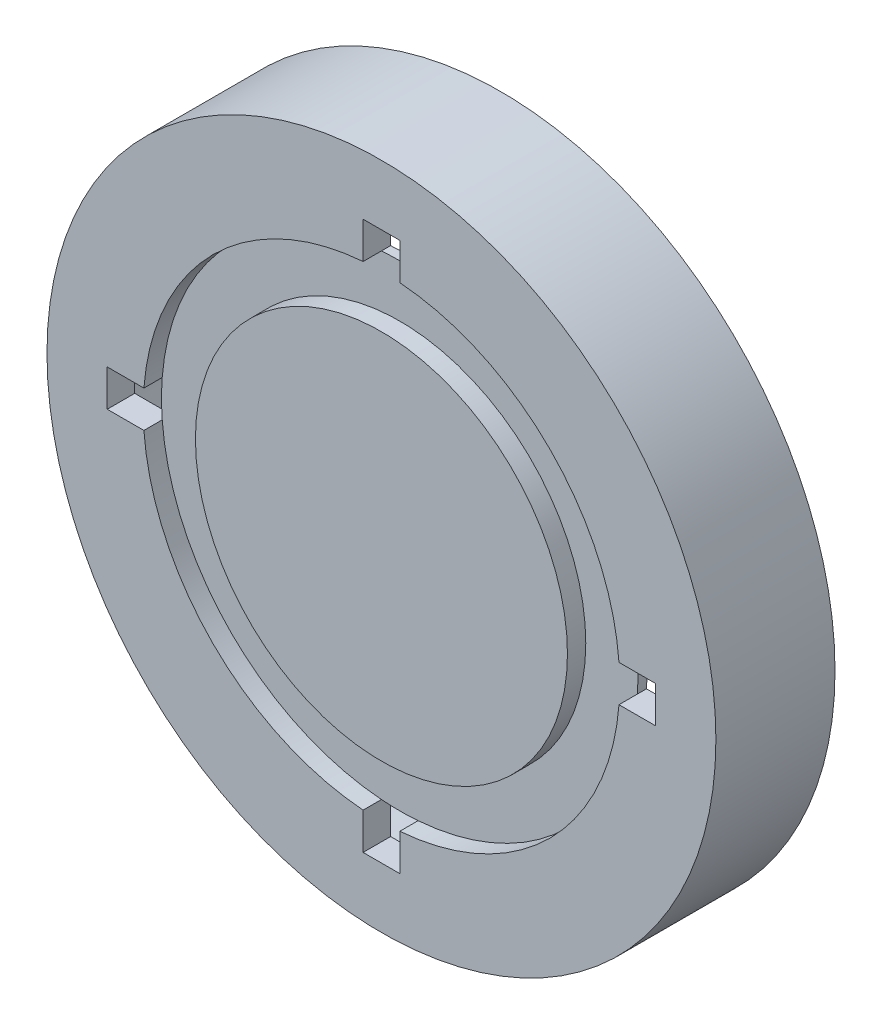
ISO-10303-21;
HEADER;
FILE_DESCRIPTION(('STEP AP214'),'2;1');
FILE_NAME('part.step','',(''),(''),'','','');
FILE_SCHEMA(('AUTOMOTIVE_DESIGN { 1 0 10303 214 1 1 1 1 }'));
ENDSEC;
DATA;
#1=APPLICATION_CONTEXT('core data for automotive mechanical design processes');
#2=APPLICATION_PROTOCOL_DEFINITION('international standard','automotive_design',2000,#1);
#3=PRODUCT_CONTEXT('',#1,'mechanical');
#4=PRODUCT('Part','Part','',(#3));
#5=PRODUCT_RELATED_PRODUCT_CATEGORY('part','',(#4));
#6=PRODUCT_DEFINITION_FORMATION('','',#4);
#7=PRODUCT_DEFINITION_CONTEXT('part definition',#1,'design');
#8=PRODUCT_DEFINITION('design','',#6,#7);
#9=PRODUCT_DEFINITION_SHAPE('','',#8);
#10=(LENGTH_UNIT() NAMED_UNIT(*) SI_UNIT(.MILLI.,.METRE.));
#11=(NAMED_UNIT(*) PLANE_ANGLE_UNIT() SI_UNIT($,.RADIAN.));
#12=(NAMED_UNIT(*) SI_UNIT($,.STERADIAN.) SOLID_ANGLE_UNIT());
#13=UNCERTAINTY_MEASURE_WITH_UNIT(LENGTH_MEASURE(1.E-05),#10,'distance_accuracy_value','');
#14=(GEOMETRIC_REPRESENTATION_CONTEXT(3) GLOBAL_UNCERTAINTY_ASSIGNED_CONTEXT((#13)) GLOBAL_UNIT_ASSIGNED_CONTEXT((#10,
#11,#12)) REPRESENTATION_CONTEXT('',''));
#15=CARTESIAN_POINT('',(0.,0.,0.));
#16=DIRECTION('',(0.,0.,1.));
#17=DIRECTION('',(1.,0.,0.));
#18=AXIS2_PLACEMENT_3D('',#15,#16,#17);
#19=CARTESIAN_POINT('',(0.,0.,0.));
#20=DIRECTION('',(0.,0.,1.));
#21=DIRECTION('',(1.,0.,0.));
#22=AXIS2_PLACEMENT_3D('',#19,#20,#21);
#23=PLANE('',#22);
#24=DIRECTION('',(0.,1.,0.));
#25=VECTOR('',#24,1.);
#26=CARTESIAN_POINT('',(-2.54000000000013,0.,0.));
#27=LINE('',#26,#25);
#28=CARTESIAN_POINT('',(-2.53999999999999,-38.0021627479119,0.));
#29=VERTEX_POINT('',#28);
#30=CARTESIAN_POINT('',(-2.53999999999999,-32.9221627479119,0.));
#31=VERTEX_POINT('',#30);
#32=EDGE_CURVE('E213',#29,#31,#27,.T.);
#33=ORIENTED_EDGE('',*,*,#32,.F.);
#34=DIRECTION('',(1.,0.,0.));
#35=VECTOR('',#34,1.);
#36=CARTESIAN_POINT('',(0.,-38.0021627479119,0.));
#37=LINE('',#36,#35);
#38=CARTESIAN_POINT('',(2.54,-38.0021627479119,0.));
#39=VERTEX_POINT('',#38);
#40=EDGE_CURVE('E215',#29,#39,#37,.T.);
#41=ORIENTED_EDGE('',*,*,#40,.T.);
#42=DIRECTION('',(0.,1.,0.));
#43=VECTOR('',#42,1.);
#44=CARTESIAN_POINT('',(2.54000000000013,0.,0.));
#45=LINE('',#44,#43);
#46=CARTESIAN_POINT('',(2.53999999999999,-32.9221627479119,0.));
#47=VERTEX_POINT('',#46);
#48=EDGE_CURVE('E56',#39,#47,#45,.T.);
#49=ORIENTED_EDGE('',*,*,#48,.T.);
#50=CARTESIAN_POINT('',(0.,0.,0.));
#51=DIRECTION('',(0.,0.,1.));
#52=DIRECTION('',(1.,0.,0.));
#53=AXIS2_PLACEMENT_3D('',#50,#51,#52);
#54=CIRCLE('',#53,33.02);
#55=EDGE_CURVE('E220',#47,#31,#54,.F.);
#56=ORIENTED_EDGE('',*,*,#55,.T.);
#57=EDGE_LOOP('',(#33,#41,#49,#56));
#58=FACE_BOUND('',#57,.T.);
#59=CARTESIAN_POINT('',(0.,0.,0.));
#60=DIRECTION('',(0.,0.,1.));
#61=DIRECTION('',(1.,0.,0.));
#62=AXIS2_PLACEMENT_3D('',#59,#60,#61);
#63=CIRCLE('',#62,33.02);
#64=CARTESIAN_POINT('',(32.9221627479119,2.53999999999978,0.));
#65=VERTEX_POINT('',#64);
#66=CARTESIAN_POINT('',(32.9221627479119,-2.54000000000001,0.));
#67=VERTEX_POINT('',#66);
#68=EDGE_CURVE('E251',#65,#67,#63,.F.);
#69=ORIENTED_EDGE('',*,*,#68,.T.);
#70=DIRECTION('',(1.,0.,0.));
#71=VECTOR('',#70,1.);
#72=CARTESIAN_POINT('',(0.,-2.54,0.));
#73=LINE('',#72,#71);
#74=CARTESIAN_POINT('',(38.0021627479119,-2.54000000000001,0.));
#75=VERTEX_POINT('',#74);
#76=EDGE_CURVE('E241',#67,#75,#73,.T.);
#77=ORIENTED_EDGE('',*,*,#76,.T.);
#78=DIRECTION('',(0.,1.,0.));
#79=VECTOR('',#78,1.);
#80=CARTESIAN_POINT('',(38.0021627479119,0.,0.));
#81=LINE('',#80,#79);
#82=CARTESIAN_POINT('',(38.0021627479119,2.54000000000001,0.));
#83=VERTEX_POINT('',#82);
#84=EDGE_CURVE('E244',#75,#83,#81,.T.);
#85=ORIENTED_EDGE('',*,*,#84,.T.);
#86=DIRECTION('',(1.,0.,0.));
#87=VECTOR('',#86,1.);
#88=CARTESIAN_POINT('',(0.,2.54,0.));
#89=LINE('',#88,#87);
#90=EDGE_CURVE('E248',#65,#83,#89,.T.);
#91=ORIENTED_EDGE('',*,*,#90,.F.);
#92=EDGE_LOOP('',(#69,#77,#85,#91));
#93=FACE_BOUND('',#92,.T.);
#94=DIRECTION('',(0.,-1.,0.));
#95=VECTOR('',#94,1.);
#96=CARTESIAN_POINT('',(2.54,0.,0.));
#97=LINE('',#96,#95);
#98=CARTESIAN_POINT('',(2.54,38.0021627479119,0.));
#99=VERTEX_POINT('',#98);
#100=CARTESIAN_POINT('',(2.53999999999999,32.9221627479119,0.));
#101=VERTEX_POINT('',#100);
#102=EDGE_CURVE('E272',#99,#101,#97,.T.);
#103=ORIENTED_EDGE('',*,*,#102,.F.);
#104=DIRECTION('',(1.,0.,0.));
#105=VECTOR('',#104,1.);
#106=CARTESIAN_POINT('',(0.,38.0021627479119,0.));
#107=LINE('',#106,#105);
#108=CARTESIAN_POINT('',(-2.54000000000001,38.0021627479119,0.));
#109=VERTEX_POINT('',#108);
#110=EDGE_CURVE('E274',#109,#99,#107,.T.);
#111=ORIENTED_EDGE('',*,*,#110,.F.);
#112=DIRECTION('',(0.,-1.,0.));
#113=VECTOR('',#112,1.);
#114=CARTESIAN_POINT('',(-2.54000000000001,0.,0.));
#115=LINE('',#114,#113);
#116=CARTESIAN_POINT('',(-2.54000000000001,32.9221627479119,0.));
#117=VERTEX_POINT('',#116);
#118=EDGE_CURVE('E277',#109,#117,#115,.T.);
#119=ORIENTED_EDGE('',*,*,#118,.T.);
#120=CARTESIAN_POINT('',(0.,0.,0.));
#121=DIRECTION('',(0.,0.,1.));
#122=DIRECTION('',(1.,0.,0.));
#123=AXIS2_PLACEMENT_3D('',#120,#121,#122);
#124=CIRCLE('',#123,33.02);
#125=EDGE_CURVE('E280',#117,#101,#124,.F.);
#126=ORIENTED_EDGE('',*,*,#125,.T.);
#127=EDGE_LOOP('',(#103,#111,#119,#126));
#128=FACE_BOUND('',#127,.T.);
#129=DIRECTION('',(-1.,0.,0.));
#130=VECTOR('',#129,1.);
#131=CARTESIAN_POINT('',(0.,-2.54,0.));
#132=LINE('',#131,#130);
#133=CARTESIAN_POINT('',(-32.9221627479119,-2.53999999999999,0.));
#134=VERTEX_POINT('',#133);
#135=CARTESIAN_POINT('',(-38.0021627479119,-2.54,0.));
#136=VERTEX_POINT('',#135);
#137=EDGE_CURVE('E189',#134,#136,#132,.T.);
#138=ORIENTED_EDGE('',*,*,#137,.F.);
#139=CARTESIAN_POINT('',(0.,0.,0.));
#140=DIRECTION('',(0.,0.,1.));
#141=DIRECTION('',(1.,0.,0.));
#142=AXIS2_PLACEMENT_3D('',#139,#140,#141);
#143=CIRCLE('',#142,33.02);
#144=CARTESIAN_POINT('',(-32.9221627479119,2.53999999999999,0.));
#145=VERTEX_POINT('',#144);
#146=EDGE_CURVE('E174',#134,#145,#143,.F.);
#147=ORIENTED_EDGE('',*,*,#146,.T.);
#148=DIRECTION('',(-1.,0.,0.));
#149=VECTOR('',#148,1.);
#150=CARTESIAN_POINT('',(0.,2.54,0.));
#151=LINE('',#150,#149);
#152=CARTESIAN_POINT('',(-38.0021627479119,2.54,0.));
#153=VERTEX_POINT('',#152);
#154=EDGE_CURVE('E182',#145,#153,#151,.T.);
#155=ORIENTED_EDGE('',*,*,#154,.T.);
#156=DIRECTION('',(0.,1.,0.));
#157=VECTOR('',#156,1.);
#158=CARTESIAN_POINT('',(-38.0021627479119,0.,0.));
#159=LINE('',#158,#157);
#160=EDGE_CURVE('E186',#136,#153,#159,.T.);
#161=ORIENTED_EDGE('',*,*,#160,.F.);
#162=EDGE_LOOP('',(#138,#147,#155,#161));
#163=FACE_BOUND('',#162,.T.);
#164=CARTESIAN_POINT('',(0.,0.,0.));
#165=DIRECTION('',(0.,0.,-1.));
#166=DIRECTION('',(-1.,0.,0.));
#167=AXIS2_PLACEMENT_3D('',#164,#165,#166);
#168=CIRCLE('',#167,44.45);
#169=CARTESIAN_POINT('',(44.45,0.,0.));
#170=VERTEX_POINT('',#169);
#171=EDGE_CURVE('E598',#170,#170,#168,.T.);
#172=ORIENTED_EDGE('',*,*,#171,.T.);
#173=EDGE_LOOP('',(#172));
#174=FACE_BOUND('',#173,.T.);
#175=ADVANCED_FACE('F33',(#58,#93,#128,#163,#174),#23,.F.);
#176=CARTESIAN_POINT('',(0.,0.,3.81));
#177=DIRECTION('',(0.,0.,1.));
#178=DIRECTION('',(1.,0.,0.));
#179=AXIS2_PLACEMENT_3D('',#176,#177,#178);
#180=PLANE('',#179);
#181=CARTESIAN_POINT('',(0.,0.,3.81));
#182=DIRECTION('',(0.,0.,1.));
#183=DIRECTION('',(1.,0.,0.));
#184=AXIS2_PLACEMENT_3D('',#181,#182,#183);
#185=CIRCLE('',#184,46.355);
#186=CARTESIAN_POINT('',(-46.355,0.,3.81));
#187=VERTEX_POINT('',#186);
#188=EDGE_CURVE('E11',#187,#187,#185,.T.);
#189=ORIENTED_EDGE('',*,*,#188,.T.);
#190=EDGE_LOOP('',(#189));
#191=FACE_BOUND('',#190,.T.);
#192=CARTESIAN_POINT('',(0.,0.,3.81));
#193=DIRECTION('',(0.,0.,1.));
#194=DIRECTION('',(1.,0.,0.));
#195=AXIS2_PLACEMENT_3D('',#192,#193,#194);
#196=CIRCLE('',#195,33.02);
#197=CARTESIAN_POINT('',(-32.9221627479119,-2.53999999999999,3.81));
#198=VERTEX_POINT('',#197);
#199=CARTESIAN_POINT('',(-2.53999999999999,-32.9221627479119,3.81));
#200=VERTEX_POINT('',#199);
#201=EDGE_CURVE('E312',#198,#200,#196,.T.);
#202=ORIENTED_EDGE('',*,*,#201,.F.);
#203=DIRECTION('',(-1.,0.,0.));
#204=VECTOR('',#203,1.);
#205=CARTESIAN_POINT('',(0.,-2.54,3.81));
#206=LINE('',#205,#204);
#207=CARTESIAN_POINT('',(-38.0021627479119,-2.54,3.81));
#208=VERTEX_POINT('',#207);
#209=EDGE_CURVE('E190',#198,#208,#206,.T.);
#210=ORIENTED_EDGE('',*,*,#209,.T.);
#211=DIRECTION('',(0.,1.,0.));
#212=VECTOR('',#211,1.);
#213=CARTESIAN_POINT('',(-38.0021627479119,0.,3.81));
#214=LINE('',#213,#212);
#215=CARTESIAN_POINT('',(-38.0021627479119,2.54,3.81));
#216=VERTEX_POINT('',#215);
#217=EDGE_CURVE('E193',#208,#216,#214,.T.);
#218=ORIENTED_EDGE('',*,*,#217,.T.);
#219=DIRECTION('',(-1.,0.,0.));
#220=VECTOR('',#219,1.);
#221=CARTESIAN_POINT('',(0.,2.54,3.81));
#222=LINE('',#221,#220);
#223=CARTESIAN_POINT('',(-32.9221627479119,2.53999999999999,3.81));
#224=VERTEX_POINT('',#223);
#225=EDGE_CURVE('E201',#224,#216,#222,.T.);
#226=ORIENTED_EDGE('',*,*,#225,.F.);
#227=CARTESIAN_POINT('',(-2.54000000000001,32.9221627479119,3.81));
#228=VERTEX_POINT('',#227);
#229=EDGE_CURVE('E310',#228,#224,#196,.T.);
#230=ORIENTED_EDGE('',*,*,#229,.F.);
#231=DIRECTION('',(0.,-1.,0.));
#232=VECTOR('',#231,1.);
#233=CARTESIAN_POINT('',(-2.54000000000001,0.,3.81));
#234=LINE('',#233,#232);
#235=CARTESIAN_POINT('',(-2.54000000000001,38.0021627479119,3.81));
#236=VERTEX_POINT('',#235);
#237=EDGE_CURVE('E275',#236,#228,#234,.T.);
#238=ORIENTED_EDGE('',*,*,#237,.F.);
#239=DIRECTION('',(1.,0.,0.));
#240=VECTOR('',#239,1.);
#241=CARTESIAN_POINT('',(0.,38.0021627479119,3.81));
#242=LINE('',#241,#240);
#243=CARTESIAN_POINT('',(2.54,38.0021627479119,3.81));
#244=VERTEX_POINT('',#243);
#245=EDGE_CURVE('E286',#236,#244,#242,.T.);
#246=ORIENTED_EDGE('',*,*,#245,.T.);
#247=DIRECTION('',(0.,-1.,0.));
#248=VECTOR('',#247,1.);
#249=CARTESIAN_POINT('',(2.54,0.,3.81));
#250=LINE('',#249,#248);
#251=CARTESIAN_POINT('',(2.53999999999999,32.9221627479119,3.81));
#252=VERTEX_POINT('',#251);
#253=EDGE_CURVE('E208',#244,#252,#250,.T.);
#254=ORIENTED_EDGE('',*,*,#253,.T.);
#255=CARTESIAN_POINT('',(32.9221627479119,2.53999999999978,3.81));
#256=VERTEX_POINT('',#255);
#257=EDGE_CURVE('E304',#256,#252,#196,.T.);
#258=ORIENTED_EDGE('',*,*,#257,.F.);
#259=DIRECTION('',(1.,0.,0.));
#260=VECTOR('',#259,1.);
#261=CARTESIAN_POINT('',(0.,2.54,3.81));
#262=LINE('',#261,#260);
#263=CARTESIAN_POINT('',(38.0021627479119,2.54000000000001,3.81));
#264=VERTEX_POINT('',#263);
#265=EDGE_CURVE('E245',#256,#264,#262,.T.);
#266=ORIENTED_EDGE('',*,*,#265,.T.);
#267=DIRECTION('',(0.,1.,0.));
#268=VECTOR('',#267,1.);
#269=CARTESIAN_POINT('',(38.0021627479119,0.,3.81));
#270=LINE('',#269,#268);
#271=CARTESIAN_POINT('',(38.0021627479119,-2.54000000000001,3.81));
#272=VERTEX_POINT('',#271);
#273=EDGE_CURVE('E258',#272,#264,#270,.T.);
#274=ORIENTED_EDGE('',*,*,#273,.F.);
#275=DIRECTION('',(1.,0.,0.));
#276=VECTOR('',#275,1.);
#277=CARTESIAN_POINT('',(0.,-2.54,3.81));
#278=LINE('',#277,#276);
#279=CARTESIAN_POINT('',(32.9221627479119,-2.54000000000001,3.81));
#280=VERTEX_POINT('',#279);
#281=EDGE_CURVE('E255',#280,#272,#278,.T.);
#282=ORIENTED_EDGE('',*,*,#281,.F.);
#283=CARTESIAN_POINT('',(2.53999999999999,-32.9221627479119,3.81));
#284=VERTEX_POINT('',#283);
#285=EDGE_CURVE('E318',#284,#280,#196,.T.);
#286=ORIENTED_EDGE('',*,*,#285,.F.);
#287=DIRECTION('',(0.,1.,0.));
#288=VECTOR('',#287,1.);
#289=CARTESIAN_POINT('',(2.54000000000013,0.,3.81));
#290=LINE('',#289,#288);
#291=CARTESIAN_POINT('',(2.54,-38.0021627479119,3.81));
#292=VERTEX_POINT('',#291);
#293=EDGE_CURVE('E216',#292,#284,#290,.T.);
#294=ORIENTED_EDGE('',*,*,#293,.F.);
#295=DIRECTION('',(1.,0.,0.));
#296=VECTOR('',#295,1.);
#297=CARTESIAN_POINT('',(0.,-38.0021627479119,3.81));
#298=LINE('',#297,#296);
#299=CARTESIAN_POINT('',(-2.53999999999999,-38.0021627479119,3.81));
#300=VERTEX_POINT('',#299);
#301=EDGE_CURVE('E227',#300,#292,#298,.T.);
#302=ORIENTED_EDGE('',*,*,#301,.F.);
#303=DIRECTION('',(0.,1.,0.));
#304=VECTOR('',#303,1.);
#305=CARTESIAN_POINT('',(-2.54000000000013,0.,3.81));
#306=LINE('',#305,#304);
#307=EDGE_CURVE('E224',#300,#200,#306,.T.);
#308=ORIENTED_EDGE('',*,*,#307,.T.);
#309=EDGE_LOOP('',(#202,#210,#218,#226,#230,#238,#246,#254,#258,#266,#274,#282,#286,#294,#302,#308));
#310=FACE_BOUND('',#309,.T.);
#311=ADVANCED_FACE('F337',(#191,#310),#180,.T.);
#312=CARTESIAN_POINT('',(0.,0.,1.27));
#313=DIRECTION('',(0.,0.,1.));
#314=DIRECTION('',(1.,0.,0.));
#315=AXIS2_PLACEMENT_3D('',#312,#313,#314);
#316=CYLINDRICAL_SURFACE('',#315,33.02);
#317=DIRECTION('',(0.,0.,1.));
#318=VECTOR('',#317,1.);
#319=CARTESIAN_POINT('',(-32.9221627479119,-2.53999999999999,0.));
#320=LINE('',#319,#318);
#321=CARTESIAN_POINT('',(-32.9221627479119,-2.54,1.27));
#322=VERTEX_POINT('',#321);
#323=EDGE_CURVE('E209',#322,#198,#320,.T.);
#324=ORIENTED_EDGE('',*,*,#323,.T.);
#325=ORIENTED_EDGE('',*,*,#201,.T.);
#326=DIRECTION('',(0.,0.,1.));
#327=VECTOR('',#326,1.);
#328=CARTESIAN_POINT('',(-2.53999999999999,-32.9221627479119,0.));
#329=LINE('',#328,#327);
#330=CARTESIAN_POINT('',(-2.53999999999999,-32.9221627479119,1.27));
#331=VERTEX_POINT('',#330);
#332=EDGE_CURVE('E234',#331,#200,#329,.T.);
#333=ORIENTED_EDGE('',*,*,#332,.F.);
#334=CARTESIAN_POINT('',(0.,0.,1.27));
#335=DIRECTION('',(0.,0.,1.));
#336=DIRECTION('',(1.,0.,0.));
#337=AXIS2_PLACEMENT_3D('',#334,#335,#336);
#338=CIRCLE('',#337,33.02);
#339=EDGE_CURVE('E354',#322,#331,#338,.T.);
#340=ORIENTED_EDGE('',*,*,#339,.F.);
#341=EDGE_LOOP('',(#324,#325,#333,#340));
#342=FACE_BOUND('',#341,.T.);
#343=ADVANCED_FACE('F375',(#342),#316,.F.);
#344=ORIENTED_EDGE('',*,*,#229,.T.);
#345=DIRECTION('',(0.,0.,1.));
#346=VECTOR('',#345,1.);
#347=CARTESIAN_POINT('',(-32.9221627479119,2.53999999999999,0.));
#348=LINE('',#347,#346);
#349=CARTESIAN_POINT('',(-32.9221627479119,2.53999999999999,1.27));
#350=VERTEX_POINT('',#349);
#351=EDGE_CURVE('E179',#350,#224,#348,.T.);
#352=ORIENTED_EDGE('',*,*,#351,.F.);
#353=CARTESIAN_POINT('',(-2.54000000000001,32.9221627479119,1.27));
#354=VERTEX_POINT('',#353);
#355=EDGE_CURVE('E308',#354,#350,#338,.T.);
#356=ORIENTED_EDGE('',*,*,#355,.F.);
#357=DIRECTION('',(0.,0.,1.));
#358=VECTOR('',#357,1.);
#359=CARTESIAN_POINT('',(-2.54000000000001,32.9221627479119,0.));
#360=LINE('',#359,#358);
#361=EDGE_CURVE('E297',#354,#228,#360,.T.);
#362=ORIENTED_EDGE('',*,*,#361,.T.);
#363=EDGE_LOOP('',(#344,#352,#356,#362));
#364=FACE_BOUND('',#363,.T.);
#365=ADVANCED_FACE('F361',(#364),#316,.F.);
#366=DIRECTION('',(0.,0.,1.));
#367=VECTOR('',#366,1.);
#368=CARTESIAN_POINT('',(32.9221627479119,2.53999999999978,0.));
#369=LINE('',#368,#367);
#370=CARTESIAN_POINT('',(32.9221627479119,2.54000000000001,1.27));
#371=VERTEX_POINT('',#370);
#372=EDGE_CURVE('E268',#371,#256,#369,.T.);
#373=ORIENTED_EDGE('',*,*,#372,.T.);
#374=ORIENTED_EDGE('',*,*,#257,.T.);
#375=DIRECTION('',(0.,0.,1.));
#376=VECTOR('',#375,1.);
#377=CARTESIAN_POINT('',(2.53999999999999,32.9221627479119,0.));
#378=LINE('',#377,#376);
#379=CARTESIAN_POINT('',(2.53999999999999,32.9221627479119,1.27));
#380=VERTEX_POINT('',#379);
#381=EDGE_CURVE('E294',#380,#252,#378,.T.);
#382=ORIENTED_EDGE('',*,*,#381,.F.);
#383=EDGE_CURVE('E309',#371,#380,#338,.T.);
#384=ORIENTED_EDGE('',*,*,#383,.F.);
#385=EDGE_LOOP('',(#373,#374,#382,#384));
#386=FACE_BOUND('',#385,.T.);
#387=ADVANCED_FACE('F408',(#386),#316,.F.);
#388=CARTESIAN_POINT('',(2.54000000000001,-32.9221627479119,1.27));
#389=VERTEX_POINT('',#388);
#390=CARTESIAN_POINT('',(32.9221627479119,-2.54000000000001,1.27));
#391=VERTEX_POINT('',#390);
#392=EDGE_CURVE('E351',#389,#391,#338,.T.);
#393=ORIENTED_EDGE('',*,*,#392,.F.);
#394=DIRECTION('',(0.,0.,1.));
#395=VECTOR('',#394,1.);
#396=CARTESIAN_POINT('',(2.53999999999999,-32.9221627479119,0.));
#397=LINE('',#396,#395);
#398=EDGE_CURVE('E237',#389,#284,#397,.T.);
#399=ORIENTED_EDGE('',*,*,#398,.T.);
#400=ORIENTED_EDGE('',*,*,#285,.T.);
#401=DIRECTION('',(0.,0.,1.));
#402=VECTOR('',#401,1.);
#403=CARTESIAN_POINT('',(32.9221627479119,-2.54000000000001,0.));
#404=LINE('',#403,#402);
#405=EDGE_CURVE('E265',#391,#280,#404,.T.);
#406=ORIENTED_EDGE('',*,*,#405,.F.);
#407=EDGE_LOOP('',(#393,#399,#400,#406));
#408=FACE_BOUND('',#407,.T.);
#409=ADVANCED_FACE('F330',(#408),#316,.F.);
#410=CARTESIAN_POINT('',(0.,0.,3.81));
#411=DIRECTION('',(0.,0.,-1.));
#412=DIRECTION('',(-1.,0.,0.));
#413=AXIS2_PLACEMENT_3D('',#410,#411,#412);
#414=CYLINDRICAL_SURFACE('',#413,46.355);
#415=CARTESIAN_POINT('',(0.,0.,-12.7));
#416=DIRECTION('',(0.,0.,-1.));
#417=DIRECTION('',(-1.,0.,0.));
#418=AXIS2_PLACEMENT_3D('',#415,#416,#417);
#419=CIRCLE('',#418,46.355);
#420=CARTESIAN_POINT('',(-46.355,0.,-12.7));
#421=VERTEX_POINT('',#420);
#422=EDGE_CURVE('E196',#421,#421,#419,.T.);
#423=CARTESIAN_POINT('',(-46.355,0.,3.81));
#424=CARTESIAN_POINT('',(-46.355,0.,3.63802083333333));
#425=CARTESIAN_POINT('',(-46.355,0.,3.46604166666667));
#426=CARTESIAN_POINT('',(-46.355,0.,3.12208333333333));
#427=CARTESIAN_POINT('',(-46.355,0.,2.95010416666667));
#428=CARTESIAN_POINT('',(-46.355,0.,2.60614583333333));
#429=CARTESIAN_POINT('',(-46.355,0.,2.43416666666667));
#430=CARTESIAN_POINT('',(-46.355,0.,2.09020833333333));
#431=CARTESIAN_POINT('',(-46.355,0.,1.91822916666667));
#432=CARTESIAN_POINT('',(-46.355,0.,1.57427083333333));
#433=CARTESIAN_POINT('',(-46.355,0.,1.40229166666667));
#434=CARTESIAN_POINT('',(-46.355,0.,1.05833333333333));
#435=CARTESIAN_POINT('',(-46.355,0.,0.886354166666666));
#436=CARTESIAN_POINT('',(-46.355,0.,0.542395833333333));
#437=CARTESIAN_POINT('',(-46.355,0.,0.370416666666666));
#438=CARTESIAN_POINT('',(-46.355,0.,0.0264583333333325));
#439=CARTESIAN_POINT('',(-46.355,0.,-0.145520833333334));
#440=CARTESIAN_POINT('',(-46.355,0.,-0.489479166666667));
#441=CARTESIAN_POINT('',(-46.355,0.,-0.661458333333334));
#442=CARTESIAN_POINT('',(-46.355,0.,-1.00541666666667));
#443=CARTESIAN_POINT('',(-46.355,0.,-1.17739583333333));
#444=CARTESIAN_POINT('',(-46.355,0.,-1.52135416666667));
#445=CARTESIAN_POINT('',(-46.355,0.,-1.69333333333333));
#446=CARTESIAN_POINT('',(-46.355,0.,-2.03729166666667));
#447=CARTESIAN_POINT('',(-46.355,0.,-2.20927083333333));
#448=CARTESIAN_POINT('',(-46.355,0.,-2.55322916666667));
#449=CARTESIAN_POINT('',(-46.355,0.,-2.72520833333333));
#450=CARTESIAN_POINT('',(-46.355,0.,-3.06916666666667));
#451=CARTESIAN_POINT('',(-46.355,0.,-3.24114583333333));
#452=CARTESIAN_POINT('',(-46.355,0.,-3.58510416666667));
#453=CARTESIAN_POINT('',(-46.355,0.,-3.75708333333334));
#454=CARTESIAN_POINT('',(-46.355,0.,-4.10104166666667));
#455=CARTESIAN_POINT('',(-46.355,0.,-4.27302083333333));
#456=CARTESIAN_POINT('',(-46.355,0.,-4.61697916666667));
#457=CARTESIAN_POINT('',(-46.355,0.,-4.78895833333334));
#458=CARTESIAN_POINT('',(-46.355,0.,-5.13291666666667));
#459=CARTESIAN_POINT('',(-46.355,0.,-5.30489583333333));
#460=CARTESIAN_POINT('',(-46.355,0.,-5.64885416666667));
#461=CARTESIAN_POINT('',(-46.355,0.,-5.82083333333333));
#462=CARTESIAN_POINT('',(-46.355,0.,-6.16479166666667));
#463=CARTESIAN_POINT('',(-46.355,0.,-6.33677083333333));
#464=CARTESIAN_POINT('',(-46.355,0.,-6.68072916666667));
#465=CARTESIAN_POINT('',(-46.355,0.,-6.85270833333333));
#466=CARTESIAN_POINT('',(-46.355,0.,-7.19666666666667));
#467=CARTESIAN_POINT('',(-46.355,0.,-7.36864583333334));
#468=CARTESIAN_POINT('',(-46.355,0.,-7.71260416666667));
#469=CARTESIAN_POINT('',(-46.355,0.,-7.88458333333334));
#470=CARTESIAN_POINT('',(-46.355,0.,-8.22854166666667));
#471=CARTESIAN_POINT('',(-46.355,0.,-8.40052083333333));
#472=CARTESIAN_POINT('',(-46.355,0.,-8.74447916666667));
#473=CARTESIAN_POINT('',(-46.355,0.,-8.91645833333333));
#474=CARTESIAN_POINT('',(-46.355,0.,-9.26041666666667));
#475=CARTESIAN_POINT('',(-46.355,0.,-9.43239583333334));
#476=CARTESIAN_POINT('',(-46.355,0.,-9.77635416666667));
#477=CARTESIAN_POINT('',(-46.355,0.,-9.94833333333334));
#478=CARTESIAN_POINT('',(-46.355,0.,-10.2922916666667));
#479=CARTESIAN_POINT('',(-46.355,0.,-10.4642708333333));
#480=CARTESIAN_POINT('',(-46.355,0.,-10.8082291666667));
#481=CARTESIAN_POINT('',(-46.355,0.,-10.9802083333333));
#482=CARTESIAN_POINT('',(-46.355,0.,-11.3241666666667));
#483=CARTESIAN_POINT('',(-46.355,0.,-11.4961458333333));
#484=CARTESIAN_POINT('',(-46.355,0.,-11.8401041666667));
#485=CARTESIAN_POINT('',(-46.355,0.,-12.0120833333333));
#486=CARTESIAN_POINT('',(-46.355,0.,-12.3560416666667));
#487=CARTESIAN_POINT('',(-46.355,0.,-12.5280208333333));
#488=CARTESIAN_POINT('',(-46.355,0.,-12.7));
#489=B_SPLINE_CURVE_WITH_KNOTS('',3,(#423,#424,#425,#426,#427,#428,#429,#430,#431,#432,#433,
#434,#435,#436,#437,#438,#439,#440,#441,#442,#443,#444,#445,#446,#447,#448,#449,#450,#451,#452,
#453,#454,#455,#456,#457,#458,#459,#460,#461,#462,#463,#464,#465,#466,#467,#468,#469,#470,#471,
#472,#473,#474,#475,#476,#477,#478,#479,#480,#481,#482,#483,#484,#485,#486,#487,#488),
.UNSPECIFIED.,.F.,.F.,(4,2,2,2,2,2,2,2,2,2,2,2,2,2,2,2,2,2,2,2,2,2,2,2,2,2,2,2,2,2,2,2,4),(0.,
0.5159375,1.031875,1.5478125,2.06375,2.5796875,3.095625,3.6115625,4.1275,4.6434375,5.159375,
5.6753125,6.19125,6.7071875,7.223125,7.7390625,8.255,8.7709375,9.286875,9.8028125,10.31875,
10.8346875,11.350625,11.8665625,12.3825,12.8984375,13.414375,13.9303125,14.44625,14.9621875,
15.478125,15.9940625,16.51),.UNSPECIFIED.);
#490=EDGE_CURVE('BSEAM35',#187,#421,#489,.T.);
#491=ORIENTED_EDGE('',*,*,#188,.F.);
#492=ORIENTED_EDGE('',*,*,#422,.F.);
#493=ORIENTED_EDGE('',*,*,#490,.T.);
#494=ORIENTED_EDGE('',*,*,#490,.F.);
#495=EDGE_LOOP('',(#491,#493,#492,#494));
#496=FACE_BOUND('',#495,.T.);
#497=ADVANCED_FACE('F35',(#496),#414,.T.);
#498=CARTESIAN_POINT('',(0.,0.,1.27));
#499=DIRECTION('',(0.,0.,1.));
#500=DIRECTION('',(1.,0.,0.));
#501=AXIS2_PLACEMENT_3D('',#498,#499,#500);
#502=PLANE('',#501);
#503=CARTESIAN_POINT('',(0.,0.,1.27));
#504=DIRECTION('',(0.,0.,1.));
#505=DIRECTION('',(1.,0.,0.));
#506=AXIS2_PLACEMENT_3D('',#503,#504,#505);
#507=CIRCLE('',#506,25.781);
#508=CARTESIAN_POINT('',(25.781,0.,1.27));
#509=VERTEX_POINT('',#508);
#510=EDGE_CURVE('E301',#509,#509,#507,.T.);
#511=ORIENTED_EDGE('',*,*,#510,.F.);
#512=EDGE_LOOP('',(#511));
#513=FACE_BOUND('',#512,.T.);
#514=EDGE_CURVE('E41',#380,#354,#338,.T.);
#515=ORIENTED_EDGE('',*,*,#514,.T.);
#516=ORIENTED_EDGE('',*,*,#355,.T.);
#517=EDGE_CURVE('E177',#350,#322,#338,.T.);
#518=ORIENTED_EDGE('',*,*,#517,.T.);
#519=ORIENTED_EDGE('',*,*,#339,.T.);
#520=EDGE_CURVE('E352',#331,#389,#338,.T.);
#521=ORIENTED_EDGE('',*,*,#520,.T.);
#522=ORIENTED_EDGE('',*,*,#392,.T.);
#523=EDGE_CURVE('E316',#391,#371,#338,.T.);
#524=ORIENTED_EDGE('',*,*,#523,.T.);
#525=ORIENTED_EDGE('',*,*,#383,.T.);
#526=EDGE_LOOP('',(#515,#516,#518,#519,#521,#522,#524,#525));
#527=FACE_BOUND('',#526,.T.);
#528=ADVANCED_FACE('F359',(#513,#527),#502,.T.);
#529=CARTESIAN_POINT('',(0.,0.,1.27));
#530=DIRECTION('',(0.,0.,1.));
#531=DIRECTION('',(1.,0.,0.));
#532=AXIS2_PLACEMENT_3D('',#529,#530,#531);
#533=CYLINDRICAL_SURFACE('',#532,25.781);
#534=ORIENTED_EDGE('',*,*,#510,.T.);
#535=EDGE_LOOP('',(#534));
#536=FACE_BOUND('',#535,.T.);
#537=CARTESIAN_POINT('',(0.,0.,3.81));
#538=DIRECTION('',(0.,0.,1.));
#539=DIRECTION('',(1.,0.,0.));
#540=AXIS2_PLACEMENT_3D('',#537,#538,#539);
#541=CIRCLE('',#540,25.781);
#542=CARTESIAN_POINT('',(25.781,0.,3.81));
#543=VERTEX_POINT('',#542);
#544=EDGE_CURVE('E293',#543,#543,#541,.T.);
#545=ORIENTED_EDGE('',*,*,#544,.F.);
#546=EDGE_LOOP('',(#545));
#547=FACE_BOUND('',#546,.T.);
#548=ADVANCED_FACE('F434',(#536,#547),#533,.T.);
#549=ORIENTED_EDGE('',*,*,#544,.T.);
#550=EDGE_LOOP('',(#549));
#551=FACE_BOUND('',#550,.T.);
#552=ADVANCED_FACE('F433',(#551),#180,.T.);
#553=CARTESIAN_POINT('',(2.54,0.,0.));
#554=DIRECTION('',(-1.,0.,0.));
#555=DIRECTION('',(0.,-1.,0.));
#556=AXIS2_PLACEMENT_3D('',#553,#554,#555);
#557=PLANE('',#556);
#558=ORIENTED_EDGE('',*,*,#253,.F.);
#559=DIRECTION('',(0.,0.,1.));
#560=VECTOR('',#559,1.);
#561=CARTESIAN_POINT('',(2.54,38.0021627479119,0.));
#562=LINE('',#561,#560);
#563=EDGE_CURVE('E283',#99,#244,#562,.T.);
#564=ORIENTED_EDGE('',*,*,#563,.F.);
#565=ORIENTED_EDGE('',*,*,#102,.T.);
#566=EDGE_CURVE('E290',#101,#380,#378,.T.);
#567=ORIENTED_EDGE('',*,*,#566,.T.);
#568=ORIENTED_EDGE('',*,*,#381,.T.);
#569=EDGE_LOOP('',(#558,#564,#565,#567,#568));
#570=FACE_BOUND('',#569,.T.);
#571=ADVANCED_FACE('F398',(#570),#557,.T.);
#572=CARTESIAN_POINT('',(0.,0.,0.));
#573=DIRECTION('',(0.,0.,1.));
#574=DIRECTION('',(1.,0.,0.));
#575=AXIS2_PLACEMENT_3D('',#572,#573,#574);
#576=CYLINDRICAL_SURFACE('',#575,33.02);
#577=ORIENTED_EDGE('',*,*,#514,.F.);
#578=ORIENTED_EDGE('',*,*,#566,.F.);
#579=ORIENTED_EDGE('',*,*,#125,.F.);
#580=EDGE_CURVE('E295',#117,#354,#360,.T.);
#581=ORIENTED_EDGE('',*,*,#580,.T.);
#582=EDGE_LOOP('',(#577,#578,#579,#581));
#583=FACE_BOUND('',#582,.T.);
#584=ADVANCED_FACE('F400',(#583),#576,.T.);
#585=CARTESIAN_POINT('',(-2.54000000000001,0.,0.));
#586=DIRECTION('',(-1.,0.,0.));
#587=DIRECTION('',(0.,0.,1.));
#588=AXIS2_PLACEMENT_3D('',#585,#586,#587);
#589=PLANE('',#588);
#590=ORIENTED_EDGE('',*,*,#237,.T.);
#591=ORIENTED_EDGE('',*,*,#361,.F.);
#592=ORIENTED_EDGE('',*,*,#580,.F.);
#593=ORIENTED_EDGE('',*,*,#118,.F.);
#594=DIRECTION('',(0.,0.,1.));
#595=VECTOR('',#594,1.);
#596=CARTESIAN_POINT('',(-2.54000000000001,38.0021627479119,0.));
#597=LINE('',#596,#595);
#598=EDGE_CURVE('E298',#109,#236,#597,.T.);
#599=ORIENTED_EDGE('',*,*,#598,.T.);
#600=EDGE_LOOP('',(#590,#591,#592,#593,#599));
#601=FACE_BOUND('',#600,.T.);
#602=ADVANCED_FACE('F402',(#601),#589,.F.);
#603=CARTESIAN_POINT('',(0.,38.0021627479119,0.));
#604=DIRECTION('',(0.,-1.,0.));
#605=DIRECTION('',(1.,0.,0.));
#606=AXIS2_PLACEMENT_3D('',#603,#604,#605);
#607=PLANE('',#606);
#608=ORIENTED_EDGE('',*,*,#245,.F.);
#609=ORIENTED_EDGE('',*,*,#598,.F.);
#610=ORIENTED_EDGE('',*,*,#110,.T.);
#611=ORIENTED_EDGE('',*,*,#563,.T.);
#612=EDGE_LOOP('',(#608,#609,#610,#611));
#613=FACE_BOUND('',#612,.T.);
#614=ADVANCED_FACE('F406',(#613),#607,.T.);
#615=CARTESIAN_POINT('',(0.,-2.54,0.));
#616=DIRECTION('',(0.,-1.,0.));
#617=DIRECTION('',(1.,0.,0.));
#618=AXIS2_PLACEMENT_3D('',#615,#616,#617);
#619=PLANE('',#618);
#620=ORIENTED_EDGE('',*,*,#281,.T.);
#621=DIRECTION('',(0.,0.,1.));
#622=VECTOR('',#621,1.);
#623=CARTESIAN_POINT('',(38.0021627479119,-2.54000000000001,0.));
#624=LINE('',#623,#622);
#625=EDGE_CURVE('E254',#75,#272,#624,.T.);
#626=ORIENTED_EDGE('',*,*,#625,.F.);
#627=ORIENTED_EDGE('',*,*,#76,.F.);
#628=EDGE_CURVE('E228',#67,#391,#404,.T.);
#629=ORIENTED_EDGE('',*,*,#628,.T.);
#630=ORIENTED_EDGE('',*,*,#405,.T.);
#631=EDGE_LOOP('',(#620,#626,#627,#629,#630));
#632=FACE_BOUND('',#631,.T.);
#633=ADVANCED_FACE('F341',(#632),#619,.F.);
#634=CARTESIAN_POINT('',(0.,0.,0.));
#635=DIRECTION('',(0.,0.,1.));
#636=DIRECTION('',(1.,0.,0.));
#637=AXIS2_PLACEMENT_3D('',#634,#635,#636);
#638=CYLINDRICAL_SURFACE('',#637,33.02);
#639=ORIENTED_EDGE('',*,*,#523,.F.);
#640=ORIENTED_EDGE('',*,*,#628,.F.);
#641=ORIENTED_EDGE('',*,*,#68,.F.);
#642=EDGE_CURVE('E266',#65,#371,#369,.T.);
#643=ORIENTED_EDGE('',*,*,#642,.T.);
#644=EDGE_LOOP('',(#639,#640,#641,#643));
#645=FACE_BOUND('',#644,.T.);
#646=ADVANCED_FACE('F346',(#645),#638,.T.);
#647=CARTESIAN_POINT('',(0.,2.54,0.));
#648=DIRECTION('',(0.,-1.,0.));
#649=DIRECTION('',(1.,0.,0.));
#650=AXIS2_PLACEMENT_3D('',#647,#648,#649);
#651=PLANE('',#650);
#652=ORIENTED_EDGE('',*,*,#265,.F.);
#653=ORIENTED_EDGE('',*,*,#372,.F.);
#654=ORIENTED_EDGE('',*,*,#642,.F.);
#655=ORIENTED_EDGE('',*,*,#90,.T.);
#656=DIRECTION('',(0.,0.,1.));
#657=VECTOR('',#656,1.);
#658=CARTESIAN_POINT('',(38.0021627479119,2.54000000000001,0.));
#659=LINE('',#658,#657);
#660=EDGE_CURVE('E269',#83,#264,#659,.T.);
#661=ORIENTED_EDGE('',*,*,#660,.T.);
#662=EDGE_LOOP('',(#652,#653,#654,#655,#661));
#663=FACE_BOUND('',#662,.T.);
#664=ADVANCED_FACE('F410',(#663),#651,.T.);
#665=CARTESIAN_POINT('',(38.0021627479119,0.,0.));
#666=DIRECTION('',(1.,0.,0.));
#667=DIRECTION('',(0.,0.,-1.));
#668=AXIS2_PLACEMENT_3D('',#665,#666,#667);
#669=PLANE('',#668);
#670=ORIENTED_EDGE('',*,*,#273,.T.);
#671=ORIENTED_EDGE('',*,*,#660,.F.);
#672=ORIENTED_EDGE('',*,*,#84,.F.);
#673=ORIENTED_EDGE('',*,*,#625,.T.);
#674=EDGE_LOOP('',(#670,#671,#672,#673));
#675=FACE_BOUND('',#674,.T.);
#676=ADVANCED_FACE('F412',(#675),#669,.F.);
#677=CARTESIAN_POINT('',(-2.54000000000013,0.,0.));
#678=DIRECTION('',(1.,0.,0.));
#679=DIRECTION('',(0.,1.,0.));
#680=AXIS2_PLACEMENT_3D('',#677,#678,#679);
#681=PLANE('',#680);
#682=ORIENTED_EDGE('',*,*,#307,.F.);
#683=DIRECTION('',(0.,0.,1.));
#684=VECTOR('',#683,1.);
#685=CARTESIAN_POINT('',(-2.53999999999999,-38.0021627479119,0.));
#686=LINE('',#685,#684);
#687=EDGE_CURVE('E223',#29,#300,#686,.T.);
#688=ORIENTED_EDGE('',*,*,#687,.F.);
#689=ORIENTED_EDGE('',*,*,#32,.T.);
#690=EDGE_CURVE('E203',#31,#331,#329,.T.);
#691=ORIENTED_EDGE('',*,*,#690,.T.);
#692=ORIENTED_EDGE('',*,*,#332,.T.);
#693=EDGE_LOOP('',(#682,#688,#689,#691,#692));
#694=FACE_BOUND('',#693,.T.);
#695=ADVANCED_FACE('F378',(#694),#681,.T.);
#696=CARTESIAN_POINT('',(0.,0.,0.));
#697=DIRECTION('',(0.,0.,1.));
#698=DIRECTION('',(1.,0.,0.));
#699=AXIS2_PLACEMENT_3D('',#696,#697,#698);
#700=CYLINDRICAL_SURFACE('',#699,33.02);
#701=ORIENTED_EDGE('',*,*,#520,.F.);
#702=ORIENTED_EDGE('',*,*,#690,.F.);
#703=ORIENTED_EDGE('',*,*,#55,.F.);
#704=EDGE_CURVE('E235',#47,#389,#397,.T.);
#705=ORIENTED_EDGE('',*,*,#704,.T.);
#706=EDGE_LOOP('',(#701,#702,#703,#705));
#707=FACE_BOUND('',#706,.T.);
#708=ADVANCED_FACE('F387',(#707),#700,.T.);
#709=CARTESIAN_POINT('',(2.54000000000013,0.,0.));
#710=DIRECTION('',(1.,0.,0.));
#711=DIRECTION('',(0.,1.,0.));
#712=AXIS2_PLACEMENT_3D('',#709,#710,#711);
#713=PLANE('',#712);
#714=ORIENTED_EDGE('',*,*,#293,.T.);
#715=ORIENTED_EDGE('',*,*,#398,.F.);
#716=ORIENTED_EDGE('',*,*,#704,.F.);
#717=ORIENTED_EDGE('',*,*,#48,.F.);
#718=DIRECTION('',(0.,0.,1.));
#719=VECTOR('',#718,1.);
#720=CARTESIAN_POINT('',(2.54,-38.0021627479119,0.));
#721=LINE('',#720,#719);
#722=EDGE_CURVE('E238',#39,#292,#721,.T.);
#723=ORIENTED_EDGE('',*,*,#722,.T.);
#724=EDGE_LOOP('',(#714,#715,#716,#717,#723));
#725=FACE_BOUND('',#724,.T.);
#726=ADVANCED_FACE('F505',(#725),#713,.F.);
#727=CARTESIAN_POINT('',(0.,-38.0021627479119,0.));
#728=DIRECTION('',(0.,-1.,0.));
#729=DIRECTION('',(0.,0.,-1.));
#730=AXIS2_PLACEMENT_3D('',#727,#728,#729);
#731=PLANE('',#730);
#732=ORIENTED_EDGE('',*,*,#301,.T.);
#733=ORIENTED_EDGE('',*,*,#722,.F.);
#734=ORIENTED_EDGE('',*,*,#40,.F.);
#735=ORIENTED_EDGE('',*,*,#687,.T.);
#736=EDGE_LOOP('',(#732,#733,#734,#735));
#737=FACE_BOUND('',#736,.T.);
#738=ADVANCED_FACE('F381',(#737),#731,.F.);
#739=CARTESIAN_POINT('',(0.,0.,0.));
#740=DIRECTION('',(0.,0.,1.));
#741=DIRECTION('',(1.,0.,0.));
#742=AXIS2_PLACEMENT_3D('',#739,#740,#741);
#743=CYLINDRICAL_SURFACE('',#742,33.02);
#744=ORIENTED_EDGE('',*,*,#517,.F.);
#745=EDGE_CURVE('E171',#145,#350,#348,.T.);
#746=ORIENTED_EDGE('',*,*,#745,.F.);
#747=ORIENTED_EDGE('',*,*,#146,.F.);
#748=EDGE_CURVE('E206',#134,#322,#320,.T.);
#749=ORIENTED_EDGE('',*,*,#748,.T.);
#750=EDGE_LOOP('',(#744,#746,#747,#749));
#751=FACE_BOUND('',#750,.T.);
#752=ADVANCED_FACE('F172',(#751),#743,.T.);
#753=CARTESIAN_POINT('',(0.,-2.54,0.));
#754=DIRECTION('',(0.,1.,0.));
#755=DIRECTION('',(0.,0.,1.));
#756=AXIS2_PLACEMENT_3D('',#753,#754,#755);
#757=PLANE('',#756);
#758=ORIENTED_EDGE('',*,*,#209,.F.);
#759=ORIENTED_EDGE('',*,*,#323,.F.);
#760=ORIENTED_EDGE('',*,*,#748,.F.);
#761=ORIENTED_EDGE('',*,*,#137,.T.);
#762=DIRECTION('',(0.,0.,1.));
#763=VECTOR('',#762,1.);
#764=CARTESIAN_POINT('',(-38.0021627479119,-2.54,0.));
#765=LINE('',#764,#763);
#766=EDGE_CURVE('E210',#136,#208,#765,.T.);
#767=ORIENTED_EDGE('',*,*,#766,.T.);
#768=EDGE_LOOP('',(#758,#759,#760,#761,#767));
#769=FACE_BOUND('',#768,.T.);
#770=ADVANCED_FACE('F370',(#769),#757,.T.);
#771=CARTESIAN_POINT('',(-38.0021627479119,0.,0.));
#772=DIRECTION('',(1.,0.,0.));
#773=DIRECTION('',(0.,0.,-1.));
#774=AXIS2_PLACEMENT_3D('',#771,#772,#773);
#775=PLANE('',#774);
#776=ORIENTED_EDGE('',*,*,#217,.F.);
#777=ORIENTED_EDGE('',*,*,#766,.F.);
#778=ORIENTED_EDGE('',*,*,#160,.T.);
#779=DIRECTION('',(0.,0.,1.));
#780=VECTOR('',#779,1.);
#781=CARTESIAN_POINT('',(-38.0021627479119,2.54,0.));
#782=LINE('',#781,#780);
#783=EDGE_CURVE('E48',#153,#216,#782,.T.);
#784=ORIENTED_EDGE('',*,*,#783,.T.);
#785=EDGE_LOOP('',(#776,#777,#778,#784));
#786=FACE_BOUND('',#785,.T.);
#787=ADVANCED_FACE('F368',(#786),#775,.T.);
#788=CARTESIAN_POINT('',(0.,2.54,0.));
#789=DIRECTION('',(0.,1.,0.));
#790=DIRECTION('',(0.,0.,1.));
#791=AXIS2_PLACEMENT_3D('',#788,#789,#790);
#792=PLANE('',#791);
#793=ORIENTED_EDGE('',*,*,#225,.T.);
#794=ORIENTED_EDGE('',*,*,#783,.F.);
#795=ORIENTED_EDGE('',*,*,#154,.F.);
#796=ORIENTED_EDGE('',*,*,#745,.T.);
#797=ORIENTED_EDGE('',*,*,#351,.T.);
#798=EDGE_LOOP('',(#793,#794,#795,#796,#797));
#799=FACE_BOUND('',#798,.T.);
#800=ADVANCED_FACE('F183',(#799),#792,.F.);
#801=CARTESIAN_POINT('',(0.,0.,-12.7));
#802=DIRECTION('',(0.,0.,-1.));
#803=DIRECTION('',(-1.,0.,0.));
#804=AXIS2_PLACEMENT_3D('',#801,#802,#803);
#805=PLANE('',#804);
#806=ORIENTED_EDGE('',*,*,#422,.T.);
#807=EDGE_LOOP('',(#806));
#808=FACE_BOUND('',#807,.T.);
#809=CARTESIAN_POINT('',(0.,0.,-12.7));
#810=DIRECTION('',(0.,0.,-1.));
#811=DIRECTION('',(-1.,0.,0.));
#812=AXIS2_PLACEMENT_3D('',#809,#810,#811);
#813=CIRCLE('',#812,44.45);
#814=CARTESIAN_POINT('',(44.45,0.,-12.7));
#815=VERTEX_POINT('',#814);
#816=EDGE_CURVE('E595',#815,#815,#813,.T.);
#817=ORIENTED_EDGE('',*,*,#816,.F.);
#818=EDGE_LOOP('',(#817));
#819=FACE_BOUND('',#818,.T.);
#820=ADVANCED_FACE('F554',(#808,#819),#805,.T.);
#821=CARTESIAN_POINT('',(0.,0.,-12.7));
#822=DIRECTION('',(0.,0.,1.));
#823=DIRECTION('',(1.,0.,0.));
#824=AXIS2_PLACEMENT_3D('',#821,#822,#823);
#825=CYLINDRICAL_SURFACE('',#824,44.45);
#826=CARTESIAN_POINT('',(44.45,0.,-12.7));
#827=CARTESIAN_POINT('',(44.45,0.,-12.5677083333333));
#828=CARTESIAN_POINT('',(44.45,0.,-12.4354166666667));
#829=CARTESIAN_POINT('',(44.45,0.,-12.1708333333333));
#830=CARTESIAN_POINT('',(44.45,0.,-12.0385416666667));
#831=CARTESIAN_POINT('',(44.45,0.,-11.7739583333333));
#832=CARTESIAN_POINT('',(44.45,0.,-11.6416666666667));
#833=CARTESIAN_POINT('',(44.45,0.,-11.3770833333333));
#834=CARTESIAN_POINT('',(44.45,0.,-11.2447916666667));
#835=CARTESIAN_POINT('',(44.45,0.,-10.9802083333333));
#836=CARTESIAN_POINT('',(44.45,0.,-10.8479166666667));
#837=CARTESIAN_POINT('',(44.45,0.,-10.5833333333333));
#838=CARTESIAN_POINT('',(44.45,0.,-10.4510416666667));
#839=CARTESIAN_POINT('',(44.45,0.,-10.1864583333333));
#840=CARTESIAN_POINT('',(44.45,0.,-10.0541666666667));
#841=CARTESIAN_POINT('',(44.45,0.,-9.78958333333333));
#842=CARTESIAN_POINT('',(44.45,0.,-9.65729166666667));
#843=CARTESIAN_POINT('',(44.45,0.,-9.39270833333333));
#844=CARTESIAN_POINT('',(44.45,0.,-9.26041666666667));
#845=CARTESIAN_POINT('',(44.45,0.,-8.99583333333334));
#846=CARTESIAN_POINT('',(44.45,0.,-8.86354166666667));
#847=CARTESIAN_POINT('',(44.45,0.,-8.59895833333334));
#848=CARTESIAN_POINT('',(44.45,0.,-8.46666666666667));
#849=CARTESIAN_POINT('',(44.45,0.,-8.20208333333333));
#850=CARTESIAN_POINT('',(44.45,0.,-8.06979166666667));
#851=CARTESIAN_POINT('',(44.45,0.,-7.80520833333333));
#852=CARTESIAN_POINT('',(44.45,0.,-7.67291666666667));
#853=CARTESIAN_POINT('',(44.45,0.,-7.40833333333333));
#854=CARTESIAN_POINT('',(44.45,0.,-7.27604166666667));
#855=CARTESIAN_POINT('',(44.45,0.,-7.01145833333333));
#856=CARTESIAN_POINT('',(44.45,0.,-6.87916666666667));
#857=CARTESIAN_POINT('',(44.45,0.,-6.61458333333333));
#858=CARTESIAN_POINT('',(44.45,0.,-6.48229166666667));
#859=CARTESIAN_POINT('',(44.45,0.,-6.21770833333333));
#860=CARTESIAN_POINT('',(44.45,0.,-6.08541666666667));
#861=CARTESIAN_POINT('',(44.45,0.,-5.82083333333333));
#862=CARTESIAN_POINT('',(44.45,0.,-5.68854166666667));
#863=CARTESIAN_POINT('',(44.45,0.,-5.42395833333333));
#864=CARTESIAN_POINT('',(44.45,0.,-5.29166666666667));
#865=CARTESIAN_POINT('',(44.45,0.,-5.02708333333333));
#866=CARTESIAN_POINT('',(44.45,0.,-4.89479166666667));
#867=CARTESIAN_POINT('',(44.45,0.,-4.63020833333333));
#868=CARTESIAN_POINT('',(44.45,0.,-4.49791666666667));
#869=CARTESIAN_POINT('',(44.45,0.,-4.23333333333333));
#870=CARTESIAN_POINT('',(44.45,0.,-4.10104166666667));
#871=CARTESIAN_POINT('',(44.45,0.,-3.83645833333333));
#872=CARTESIAN_POINT('',(44.45,0.,-3.70416666666667));
#873=CARTESIAN_POINT('',(44.45,0.,-3.43958333333333));
#874=CARTESIAN_POINT('',(44.45,0.,-3.30729166666667));
#875=CARTESIAN_POINT('',(44.45,0.,-3.04270833333333));
#876=CARTESIAN_POINT('',(44.45,0.,-2.91041666666667));
#877=CARTESIAN_POINT('',(44.45,0.,-2.64583333333333));
#878=CARTESIAN_POINT('',(44.45,0.,-2.51354166666667));
#879=CARTESIAN_POINT('',(44.45,0.,-2.24895833333333));
#880=CARTESIAN_POINT('',(44.45,0.,-2.11666666666667));
#881=CARTESIAN_POINT('',(44.45,0.,-1.85208333333333));
#882=CARTESIAN_POINT('',(44.45,0.,-1.71979166666667));
#883=CARTESIAN_POINT('',(44.45,0.,-1.45520833333333));
#884=CARTESIAN_POINT('',(44.45,0.,-1.32291666666667));
#885=CARTESIAN_POINT('',(44.45,0.,-1.05833333333333));
#886=CARTESIAN_POINT('',(44.45,0.,-0.926041666666666));
#887=CARTESIAN_POINT('',(44.45,0.,-0.661458333333333));
#888=CARTESIAN_POINT('',(44.45,0.,-0.529166666666666));
#889=CARTESIAN_POINT('',(44.45,0.,-0.264583333333333));
#890=CARTESIAN_POINT('',(44.45,0.,-0.132291666666667));
#891=CARTESIAN_POINT('',(44.45,0.,0.));
#892=B_SPLINE_CURVE_WITH_KNOTS('',3,(#826,#827,#828,#829,#830,#831,#832,#833,#834,#835,#836,
#837,#838,#839,#840,#841,#842,#843,#844,#845,#846,#847,#848,#849,#850,#851,#852,#853,#854,#855,
#856,#857,#858,#859,#860,#861,#862,#863,#864,#865,#866,#867,#868,#869,#870,#871,#872,#873,#874,
#875,#876,#877,#878,#879,#880,#881,#882,#883,#884,#885,#886,#887,#888,#889,#890,#891),
.UNSPECIFIED.,.F.,.F.,(4,2,2,2,2,2,2,2,2,2,2,2,2,2,2,2,2,2,2,2,2,2,2,2,2,2,2,2,2,2,2,2,4),(0.,
0.396875,0.793749999999999,1.190625,1.5875,1.984375,2.38125,2.778125,3.175,3.571875,3.96875,
4.365625,4.7625,5.159375,5.55625,5.953125,6.35,6.746875,7.14375,7.540625,7.9375,8.334375,
8.73125,9.128125,9.525,9.921875,10.31875,10.715625,11.1125,11.509375,11.90625,12.303125,12.7),.UNSPECIFIED.);
#893=EDGE_CURVE('BSEAM578',#815,#170,#892,.T.);
#894=ORIENTED_EDGE('',*,*,#816,.T.);
#895=ORIENTED_EDGE('',*,*,#171,.F.);
#896=ORIENTED_EDGE('',*,*,#893,.T.);
#897=ORIENTED_EDGE('',*,*,#893,.F.);
#898=EDGE_LOOP('',(#894,#896,#895,#897));
#899=FACE_BOUND('',#898,.T.);
#900=ADVANCED_FACE('F578',(#899),#825,.F.);
#901=CLOSED_SHELL('',(#175,#311,#343,#365,#387,#409,#497,#528,#548,#552,#571,#584,#602,#614,
#633,#646,#664,#676,#695,#708,#726,#738,#752,#770,#787,#800,#820,#900));
#902=MANIFOLD_SOLID_BREP('B2',#901);
#903=ADVANCED_BREP_SHAPE_REPRESENTATION('',(#18,#902),#14);
#904=SHAPE_DEFINITION_REPRESENTATION(#9,#903);
ENDSEC;
END-ISO-10303-21;
